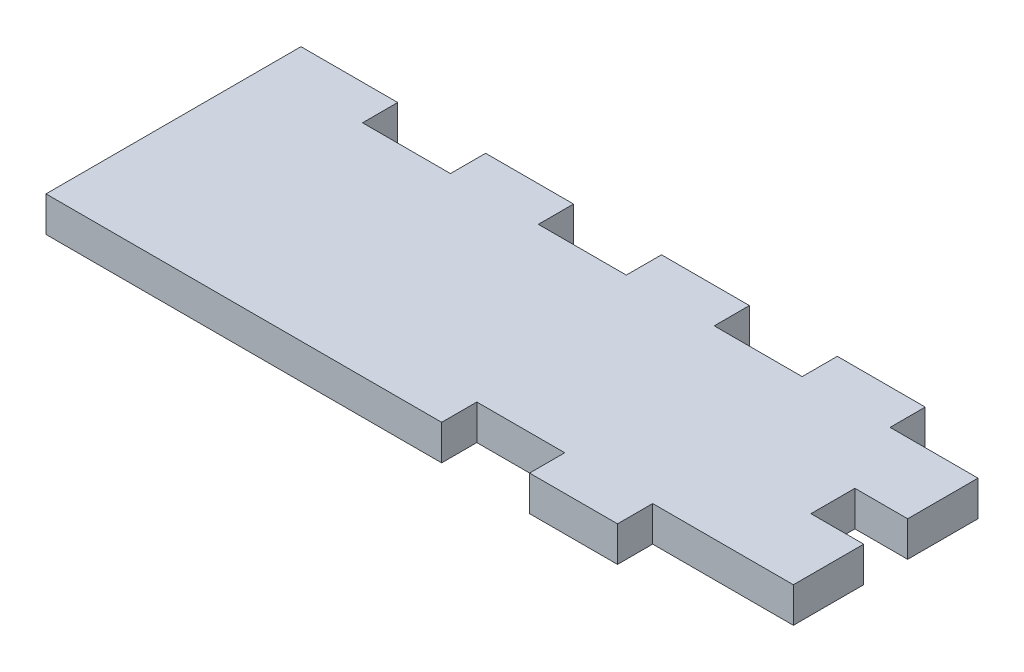
ISO-10303-21;
HEADER;
FILE_DESCRIPTION(('STEP AP214'),'2;1');
FILE_NAME('part.step','',(''),(''),'','','');
FILE_SCHEMA(('AUTOMOTIVE_DESIGN { 1 0 10303 214 1 1 1 1 }'));
ENDSEC;
DATA;
#1=APPLICATION_CONTEXT('core data for automotive mechanical design processes');
#2=APPLICATION_PROTOCOL_DEFINITION('international standard','automotive_design',2000,#1);
#3=PRODUCT_CONTEXT('',#1,'mechanical');
#4=PRODUCT('Part','Part','',(#3));
#5=PRODUCT_RELATED_PRODUCT_CATEGORY('part','',(#4));
#6=PRODUCT_DEFINITION_FORMATION('','',#4);
#7=PRODUCT_DEFINITION_CONTEXT('part definition',#1,'design');
#8=PRODUCT_DEFINITION('design','',#6,#7);
#9=PRODUCT_DEFINITION_SHAPE('','',#8);
#10=(LENGTH_UNIT() NAMED_UNIT(*) SI_UNIT(.MILLI.,.METRE.));
#11=(NAMED_UNIT(*) PLANE_ANGLE_UNIT() SI_UNIT($,.RADIAN.));
#12=(NAMED_UNIT(*) SI_UNIT($,.STERADIAN.) SOLID_ANGLE_UNIT());
#13=UNCERTAINTY_MEASURE_WITH_UNIT(LENGTH_MEASURE(1.E-05),#10,'distance_accuracy_value','');
#14=(GEOMETRIC_REPRESENTATION_CONTEXT(3) GLOBAL_UNCERTAINTY_ASSIGNED_CONTEXT((#13)) GLOBAL_UNIT_ASSIGNED_CONTEXT((#10,
#11,#12)) REPRESENTATION_CONTEXT('',''));
#15=CARTESIAN_POINT('',(0.,0.,0.));
#16=DIRECTION('',(0.,0.,1.));
#17=DIRECTION('',(1.,0.,0.));
#18=AXIS2_PLACEMENT_3D('',#15,#16,#17);
#19=CARTESIAN_POINT('',(0.,4.,21.));
#20=DIRECTION('',(0.,0.,-1.));
#21=DIRECTION('',(-1.,0.,0.));
#22=AXIS2_PLACEMENT_3D('',#19,#20,#21);
#23=PLANE('',#22);
#24=DIRECTION('',(1.,0.,0.));
#25=VECTOR('',#24,1.);
#26=CARTESIAN_POINT('',(0.,0.,21.));
#27=LINE('',#26,#25);
#28=CARTESIAN_POINT('',(45.,0.,21.));
#29=VERTEX_POINT('',#28);
#30=CARTESIAN_POINT('',(55.,0.,21.));
#31=VERTEX_POINT('',#30);
#32=EDGE_CURVE('E426',#29,#31,#27,.T.);
#33=ORIENTED_EDGE('',*,*,#32,.T.);
#34=DIRECTION('',(0.,1.,0.));
#35=VECTOR('',#34,1.);
#36=CARTESIAN_POINT('',(55.,0.,21.));
#37=LINE('',#36,#35);
#38=CARTESIAN_POINT('',(55.,4.,21.));
#39=VERTEX_POINT('',#38);
#40=EDGE_CURVE('E61',#31,#39,#37,.T.);
#41=ORIENTED_EDGE('',*,*,#40,.T.);
#42=DIRECTION('',(1.,0.,0.));
#43=VECTOR('',#42,1.);
#44=CARTESIAN_POINT('',(0.,4.,21.));
#45=LINE('',#44,#43);
#46=CARTESIAN_POINT('',(45.,4.,21.));
#47=VERTEX_POINT('',#46);
#48=EDGE_CURVE('E419',#47,#39,#45,.T.);
#49=ORIENTED_EDGE('',*,*,#48,.F.);
#50=DIRECTION('',(0.,1.,0.));
#51=VECTOR('',#50,1.);
#52=CARTESIAN_POINT('',(45.,0.,21.));
#53=LINE('',#52,#51);
#54=EDGE_CURVE('E272',#29,#47,#53,.T.);
#55=ORIENTED_EDGE('',*,*,#54,.F.);
#56=EDGE_LOOP('',(#33,#41,#49,#55));
#57=FACE_BOUND('',#56,.T.);
#58=ADVANCED_FACE('F35',(#57),#23,.F.);
#59=CARTESIAN_POINT('',(65.,4.,21.));
#60=VERTEX_POINT('',#59);
#61=CARTESIAN_POINT('',(81.,4.,21.));
#62=VERTEX_POINT('',#61);
#63=EDGE_CURVE('E53',#60,#62,#45,.T.);
#64=ORIENTED_EDGE('',*,*,#63,.F.);
#65=DIRECTION('',(0.,1.,0.));
#66=VECTOR('',#65,1.);
#67=CARTESIAN_POINT('',(65.,0.,21.));
#68=LINE('',#67,#66);
#69=CARTESIAN_POINT('',(65.,0.,21.));
#70=VERTEX_POINT('',#69);
#71=EDGE_CURVE('E257',#70,#60,#68,.T.);
#72=ORIENTED_EDGE('',*,*,#71,.F.);
#73=CARTESIAN_POINT('',(81.,0.,21.));
#74=VERTEX_POINT('',#73);
#75=EDGE_CURVE('E425',#70,#74,#27,.T.);
#76=ORIENTED_EDGE('',*,*,#75,.T.);
#77=DIRECTION('',(0.,-1.,0.));
#78=VECTOR('',#77,1.);
#79=CARTESIAN_POINT('',(81.,4.,21.));
#80=LINE('',#79,#78);
#81=EDGE_CURVE('E398',#62,#74,#80,.T.);
#82=ORIENTED_EDGE('',*,*,#81,.F.);
#83=EDGE_LOOP('',(#64,#72,#76,#82));
#84=FACE_BOUND('',#83,.T.);
#85=ADVANCED_FACE('F512',(#84),#23,.F.);
#86=CARTESIAN_POINT('',(0.,4.,0.));
#87=DIRECTION('',(0.,0.,1.));
#88=DIRECTION('',(1.,0.,0.));
#89=AXIS2_PLACEMENT_3D('',#86,#87,#88);
#90=PLANE('',#89);
#91=DIRECTION('',(-1.,0.,0.));
#92=VECTOR('',#91,1.);
#93=CARTESIAN_POINT('',(0.,0.,0.));
#94=LINE('',#93,#92);
#95=CARTESIAN_POINT('',(21.,0.,0.));
#96=VERTEX_POINT('',#95);
#97=CARTESIAN_POINT('',(11.,0.,0.));
#98=VERTEX_POINT('',#97);
#99=EDGE_CURVE('E428',#96,#98,#94,.T.);
#100=ORIENTED_EDGE('',*,*,#99,.T.);
#101=DIRECTION('',(0.,1.,0.));
#102=VECTOR('',#101,1.);
#103=CARTESIAN_POINT('',(11.,0.,0.));
#104=LINE('',#103,#102);
#105=CARTESIAN_POINT('',(11.,4.,0.));
#106=VERTEX_POINT('',#105);
#107=EDGE_CURVE('E295',#98,#106,#104,.T.);
#108=ORIENTED_EDGE('',*,*,#107,.T.);
#109=DIRECTION('',(-1.,0.,0.));
#110=VECTOR('',#109,1.);
#111=CARTESIAN_POINT('',(0.,4.,0.));
#112=LINE('',#111,#110);
#113=CARTESIAN_POINT('',(21.,4.,0.));
#114=VERTEX_POINT('',#113);
#115=EDGE_CURVE('E46',#114,#106,#112,.T.);
#116=ORIENTED_EDGE('',*,*,#115,.F.);
#117=DIRECTION('',(0.,1.,0.));
#118=VECTOR('',#117,1.);
#119=CARTESIAN_POINT('',(21.,0.,0.));
#120=LINE('',#119,#118);
#121=EDGE_CURVE('E320',#96,#114,#120,.T.);
#122=ORIENTED_EDGE('',*,*,#121,.F.);
#123=EDGE_LOOP('',(#100,#108,#116,#122));
#124=FACE_BOUND('',#123,.T.);
#125=ADVANCED_FACE('F486',(#124),#90,.F.);
#126=CARTESIAN_POINT('',(41.,0.,0.));
#127=VERTEX_POINT('',#126);
#128=CARTESIAN_POINT('',(31.,0.,0.));
#129=VERTEX_POINT('',#128);
#130=EDGE_CURVE('E431',#127,#129,#94,.T.);
#131=ORIENTED_EDGE('',*,*,#130,.T.);
#132=DIRECTION('',(0.,1.,0.));
#133=VECTOR('',#132,1.);
#134=CARTESIAN_POINT('',(31.,0.,0.));
#135=LINE('',#134,#133);
#136=CARTESIAN_POINT('',(31.,4.,0.));
#137=VERTEX_POINT('',#136);
#138=EDGE_CURVE('E317',#129,#137,#135,.T.);
#139=ORIENTED_EDGE('',*,*,#138,.T.);
#140=CARTESIAN_POINT('',(41.,4.,0.));
#141=VERTEX_POINT('',#140);
#142=EDGE_CURVE('E460',#141,#137,#112,.T.);
#143=ORIENTED_EDGE('',*,*,#142,.F.);
#144=DIRECTION('',(0.,1.,0.));
#145=VECTOR('',#144,1.);
#146=CARTESIAN_POINT('',(41.,0.,0.));
#147=LINE('',#146,#145);
#148=EDGE_CURVE('E347',#127,#141,#147,.T.);
#149=ORIENTED_EDGE('',*,*,#148,.F.);
#150=EDGE_LOOP('',(#131,#139,#143,#149));
#151=FACE_BOUND('',#150,.T.);
#152=ADVANCED_FACE('F497',(#151),#90,.F.);
#153=CARTESIAN_POINT('',(61.,0.,0.));
#154=VERTEX_POINT('',#153);
#155=CARTESIAN_POINT('',(51.,0.,0.));
#156=VERTEX_POINT('',#155);
#157=EDGE_CURVE('E435',#154,#156,#94,.T.);
#158=ORIENTED_EDGE('',*,*,#157,.T.);
#159=DIRECTION('',(0.,1.,0.));
#160=VECTOR('',#159,1.);
#161=CARTESIAN_POINT('',(51.,0.,0.));
#162=LINE('',#161,#160);
#163=CARTESIAN_POINT('',(51.,4.,0.));
#164=VERTEX_POINT('',#163);
#165=EDGE_CURVE('E344',#156,#164,#162,.T.);
#166=ORIENTED_EDGE('',*,*,#165,.T.);
#167=CARTESIAN_POINT('',(61.,4.,0.));
#168=VERTEX_POINT('',#167);
#169=EDGE_CURVE('E44',#168,#164,#112,.T.);
#170=ORIENTED_EDGE('',*,*,#169,.F.);
#171=DIRECTION('',(0.,1.,0.));
#172=VECTOR('',#171,1.);
#173=CARTESIAN_POINT('',(61.,0.,0.));
#174=LINE('',#173,#172);
#175=EDGE_CURVE('E374',#154,#168,#174,.T.);
#176=ORIENTED_EDGE('',*,*,#175,.F.);
#177=EDGE_LOOP('',(#158,#166,#170,#176));
#178=FACE_BOUND('',#177,.T.);
#179=ADVANCED_FACE('F443',(#178),#90,.F.);
#180=CARTESIAN_POINT('',(75.,4.,0.));
#181=DIRECTION('',(-1.,0.,0.));
#182=DIRECTION('',(0.,0.,1.));
#183=AXIS2_PLACEMENT_3D('',#180,#181,#182);
#184=PLANE('',#183);
#185=DIRECTION('',(0.,-1.,0.));
#186=VECTOR('',#185,1.);
#187=CARTESIAN_POINT('',(75.,4.,8.));
#188=LINE('',#187,#186);
#189=CARTESIAN_POINT('',(75.,4.,8.));
#190=VERTEX_POINT('',#189);
#191=CARTESIAN_POINT('',(75.,0.,8.));
#192=VERTEX_POINT('',#191);
#193=EDGE_CURVE('E373',#190,#192,#188,.T.);
#194=ORIENTED_EDGE('',*,*,#193,.F.);
#195=DIRECTION('',(0.,0.,-1.));
#196=VECTOR('',#195,1.);
#197=CARTESIAN_POINT('',(75.,4.,0.));
#198=LINE('',#197,#196);
#199=CARTESIAN_POINT('',(75.,4.,13.));
#200=VERTEX_POINT('',#199);
#201=EDGE_CURVE('E421',#200,#190,#198,.T.);
#202=ORIENTED_EDGE('',*,*,#201,.F.);
#203=DIRECTION('',(0.,1.,0.));
#204=VECTOR('',#203,1.);
#205=CARTESIAN_POINT('',(75.,4.,13.));
#206=LINE('',#205,#204);
#207=CARTESIAN_POINT('',(75.,0.,13.));
#208=VERTEX_POINT('',#207);
#209=EDGE_CURVE('E397',#208,#200,#206,.T.);
#210=ORIENTED_EDGE('',*,*,#209,.F.);
#211=DIRECTION('',(0.,0.,-1.));
#212=VECTOR('',#211,1.);
#213=CARTESIAN_POINT('',(75.,0.,0.));
#214=LINE('',#213,#212);
#215=EDGE_CURVE('E427',#208,#192,#214,.T.);
#216=ORIENTED_EDGE('',*,*,#215,.T.);
#217=EDGE_LOOP('',(#194,#202,#210,#216));
#218=FACE_BOUND('',#217,.T.);
#219=ADVANCED_FACE('F518',(#218),#184,.F.);
#220=CARTESIAN_POINT('',(0.,4.,0.));
#221=DIRECTION('',(1.,0.,0.));
#222=DIRECTION('',(0.,0.,-1.));
#223=AXIS2_PLACEMENT_3D('',#220,#221,#222);
#224=PLANE('',#223);
#225=DIRECTION('',(0.,0.,1.));
#226=VECTOR('',#225,1.);
#227=CARTESIAN_POINT('',(0.,0.,0.));
#228=LINE('',#227,#226);
#229=CARTESIAN_POINT('',(0.,0.,-4.));
#230=VERTEX_POINT('',#229);
#231=CARTESIAN_POINT('',(0.,0.,25.));
#232=VERTEX_POINT('',#231);
#233=EDGE_CURVE('E416',#230,#232,#228,.T.);
#234=ORIENTED_EDGE('',*,*,#233,.T.);
#235=DIRECTION('',(0.,1.,0.));
#236=VECTOR('',#235,1.);
#237=CARTESIAN_POINT('',(0.,0.,25.));
#238=LINE('',#237,#236);
#239=CARTESIAN_POINT('',(0.,4.,25.));
#240=VERTEX_POINT('',#239);
#241=EDGE_CURVE('E267',#232,#240,#238,.T.);
#242=ORIENTED_EDGE('',*,*,#241,.T.);
#243=DIRECTION('',(0.,0.,1.));
#244=VECTOR('',#243,1.);
#245=CARTESIAN_POINT('',(0.,4.,0.));
#246=LINE('',#245,#244);
#247=CARTESIAN_POINT('',(0.,4.,-4.));
#248=VERTEX_POINT('',#247);
#249=EDGE_CURVE('E417',#248,#240,#246,.T.);
#250=ORIENTED_EDGE('',*,*,#249,.F.);
#251=DIRECTION('',(0.,1.,0.));
#252=VECTOR('',#251,1.);
#253=CARTESIAN_POINT('',(0.,0.,-4.));
#254=LINE('',#253,#252);
#255=EDGE_CURVE('E275',#230,#248,#254,.T.);
#256=ORIENTED_EDGE('',*,*,#255,.F.);
#257=EDGE_LOOP('',(#234,#242,#250,#256));
#258=FACE_BOUND('',#257,.T.);
#259=ADVANCED_FACE('F37',(#258),#224,.F.);
#260=CARTESIAN_POINT('',(81.,0.,0.));
#261=VERTEX_POINT('',#260);
#262=CARTESIAN_POINT('',(71.,0.,0.));
#263=VERTEX_POINT('',#262);
#264=EDGE_CURVE('E39',#261,#263,#94,.T.);
#265=ORIENTED_EDGE('',*,*,#264,.T.);
#266=DIRECTION('',(0.,1.,0.));
#267=VECTOR('',#266,1.);
#268=CARTESIAN_POINT('',(71.,0.,0.));
#269=LINE('',#268,#267);
#270=CARTESIAN_POINT('',(71.,4.,0.));
#271=VERTEX_POINT('',#270);
#272=EDGE_CURVE('E370',#263,#271,#269,.T.);
#273=ORIENTED_EDGE('',*,*,#272,.T.);
#274=CARTESIAN_POINT('',(81.,4.,0.));
#275=VERTEX_POINT('',#274);
#276=EDGE_CURVE('E11',#275,#271,#112,.T.);
#277=ORIENTED_EDGE('',*,*,#276,.F.);
#278=DIRECTION('',(0.,1.,0.));
#279=VECTOR('',#278,1.);
#280=CARTESIAN_POINT('',(81.,4.,0.));
#281=LINE('',#280,#279);
#282=EDGE_CURVE('E379',#261,#275,#281,.T.);
#283=ORIENTED_EDGE('',*,*,#282,.F.);
#284=EDGE_LOOP('',(#265,#273,#277,#283));
#285=FACE_BOUND('',#284,.T.);
#286=ADVANCED_FACE('F521',(#285),#90,.F.);
#287=CARTESIAN_POINT('',(0.,4.,0.));
#288=DIRECTION('',(0.,1.,0.));
#289=DIRECTION('',(0.,0.,1.));
#290=AXIS2_PLACEMENT_3D('',#287,#288,#289);
#291=PLANE('',#290);
#292=DIRECTION('',(-1.,0.,0.));
#293=VECTOR('',#292,1.);
#294=CARTESIAN_POINT('',(11.,4.,-4.));
#295=LINE('',#294,#293);
#296=CARTESIAN_POINT('',(11.,4.,-4.));
#297=VERTEX_POINT('',#296);
#298=EDGE_CURVE('E287',#297,#248,#295,.T.);
#299=ORIENTED_EDGE('',*,*,#298,.T.);
#300=ORIENTED_EDGE('',*,*,#249,.T.);
#301=DIRECTION('',(1.,0.,0.));
#302=VECTOR('',#301,1.);
#303=CARTESIAN_POINT('',(0.,4.,25.));
#304=LINE('',#303,#302);
#305=CARTESIAN_POINT('',(45.,4.,25.));
#306=VERTEX_POINT('',#305);
#307=EDGE_CURVE('E256',#240,#306,#304,.T.);
#308=ORIENTED_EDGE('',*,*,#307,.T.);
#309=DIRECTION('',(0.,0.,-1.));
#310=VECTOR('',#309,1.);
#311=CARTESIAN_POINT('',(45.,4.,21.));
#312=LINE('',#311,#310);
#313=EDGE_CURVE('E264',#306,#47,#312,.T.);
#314=ORIENTED_EDGE('',*,*,#313,.T.);
#315=ORIENTED_EDGE('',*,*,#48,.T.);
#316=DIRECTION('',(0.,0.,1.));
#317=VECTOR('',#316,1.);
#318=CARTESIAN_POINT('',(55.,4.,25.));
#319=LINE('',#318,#317);
#320=CARTESIAN_POINT('',(55.,4.,25.));
#321=VERTEX_POINT('',#320);
#322=EDGE_CURVE('E252',#39,#321,#319,.T.);
#323=ORIENTED_EDGE('',*,*,#322,.T.);
#324=DIRECTION('',(1.,0.,0.));
#325=VECTOR('',#324,1.);
#326=CARTESIAN_POINT('',(55.,4.,25.));
#327=LINE('',#326,#325);
#328=CARTESIAN_POINT('',(65.,4.,25.));
#329=VERTEX_POINT('',#328);
#330=EDGE_CURVE('E229',#321,#329,#327,.T.);
#331=ORIENTED_EDGE('',*,*,#330,.T.);
#332=DIRECTION('',(0.,0.,-1.));
#333=VECTOR('',#332,1.);
#334=CARTESIAN_POINT('',(65.,4.,25.));
#335=LINE('',#334,#333);
#336=EDGE_CURVE('E246',#329,#60,#335,.T.);
#337=ORIENTED_EDGE('',*,*,#336,.T.);
#338=ORIENTED_EDGE('',*,*,#63,.T.);
#339=DIRECTION('',(0.,0.,1.));
#340=VECTOR('',#339,1.);
#341=CARTESIAN_POINT('',(81.,4.,21.));
#342=LINE('',#341,#340);
#343=CARTESIAN_POINT('',(81.,4.,13.));
#344=VERTEX_POINT('',#343);
#345=EDGE_CURVE('E405',#344,#62,#342,.T.);
#346=ORIENTED_EDGE('',*,*,#345,.F.);
#347=DIRECTION('',(-1.,0.,0.));
#348=VECTOR('',#347,1.);
#349=CARTESIAN_POINT('',(81.,4.,13.));
#350=LINE('',#349,#348);
#351=EDGE_CURVE('E408',#344,#200,#350,.T.);
#352=ORIENTED_EDGE('',*,*,#351,.T.);
#353=ORIENTED_EDGE('',*,*,#201,.T.);
#354=DIRECTION('',(-1.,0.,0.));
#355=VECTOR('',#354,1.);
#356=CARTESIAN_POINT('',(81.,4.,8.));
#357=LINE('',#356,#355);
#358=CARTESIAN_POINT('',(81.,4.,8.));
#359=VERTEX_POINT('',#358);
#360=EDGE_CURVE('E394',#359,#190,#357,.T.);
#361=ORIENTED_EDGE('',*,*,#360,.F.);
#362=DIRECTION('',(0.,0.,1.));
#363=VECTOR('',#362,1.);
#364=CARTESIAN_POINT('',(81.,4.,0.));
#365=LINE('',#364,#363);
#366=EDGE_CURVE('E382',#275,#359,#365,.T.);
#367=ORIENTED_EDGE('',*,*,#366,.F.);
#368=ORIENTED_EDGE('',*,*,#276,.T.);
#369=DIRECTION('',(0.,0.,-1.));
#370=VECTOR('',#369,1.);
#371=CARTESIAN_POINT('',(71.,4.,0.));
#372=LINE('',#371,#370);
#373=CARTESIAN_POINT('',(71.,4.,-4.));
#374=VERTEX_POINT('',#373);
#375=EDGE_CURVE('E346',#271,#374,#372,.T.);
#376=ORIENTED_EDGE('',*,*,#375,.T.);
#377=DIRECTION('',(-1.,0.,0.));
#378=VECTOR('',#377,1.);
#379=CARTESIAN_POINT('',(71.,4.,-4.));
#380=LINE('',#379,#378);
#381=CARTESIAN_POINT('',(61.,4.,-4.));
#382=VERTEX_POINT('',#381);
#383=EDGE_CURVE('E365',#374,#382,#380,.T.);
#384=ORIENTED_EDGE('',*,*,#383,.T.);
#385=DIRECTION('',(0.,0.,1.));
#386=VECTOR('',#385,1.);
#387=CARTESIAN_POINT('',(61.,4.,0.));
#388=LINE('',#387,#386);
#389=EDGE_CURVE('E357',#382,#168,#388,.T.);
#390=ORIENTED_EDGE('',*,*,#389,.T.);
#391=ORIENTED_EDGE('',*,*,#169,.T.);
#392=DIRECTION('',(0.,0.,-1.));
#393=VECTOR('',#392,1.);
#394=CARTESIAN_POINT('',(51.,4.,0.));
#395=LINE('',#394,#393);
#396=CARTESIAN_POINT('',(51.,4.,-4.));
#397=VERTEX_POINT('',#396);
#398=EDGE_CURVE('E319',#164,#397,#395,.T.);
#399=ORIENTED_EDGE('',*,*,#398,.T.);
#400=DIRECTION('',(-1.,0.,0.));
#401=VECTOR('',#400,1.);
#402=CARTESIAN_POINT('',(51.,4.,-4.));
#403=LINE('',#402,#401);
#404=CARTESIAN_POINT('',(41.,4.,-4.));
#405=VERTEX_POINT('',#404);
#406=EDGE_CURVE('E339',#397,#405,#403,.T.);
#407=ORIENTED_EDGE('',*,*,#406,.T.);
#408=DIRECTION('',(0.,0.,1.));
#409=VECTOR('',#408,1.);
#410=CARTESIAN_POINT('',(41.,4.,0.));
#411=LINE('',#410,#409);
#412=EDGE_CURVE('E330',#405,#141,#411,.T.);
#413=ORIENTED_EDGE('',*,*,#412,.T.);
#414=ORIENTED_EDGE('',*,*,#142,.T.);
#415=DIRECTION('',(0.,0.,-1.));
#416=VECTOR('',#415,1.);
#417=CARTESIAN_POINT('',(31.,4.,0.));
#418=LINE('',#417,#416);
#419=CARTESIAN_POINT('',(31.,4.,-4.));
#420=VERTEX_POINT('',#419);
#421=EDGE_CURVE('E297',#137,#420,#418,.T.);
#422=ORIENTED_EDGE('',*,*,#421,.T.);
#423=DIRECTION('',(-1.,0.,0.));
#424=VECTOR('',#423,1.);
#425=CARTESIAN_POINT('',(31.,4.,-4.));
#426=LINE('',#425,#424);
#427=CARTESIAN_POINT('',(21.,4.,-4.));
#428=VERTEX_POINT('',#427);
#429=EDGE_CURVE('E312',#420,#428,#426,.T.);
#430=ORIENTED_EDGE('',*,*,#429,.T.);
#431=DIRECTION('',(0.,0.,1.));
#432=VECTOR('',#431,1.);
#433=CARTESIAN_POINT('',(21.,4.,0.));
#434=LINE('',#433,#432);
#435=EDGE_CURVE('E303',#428,#114,#434,.T.);
#436=ORIENTED_EDGE('',*,*,#435,.T.);
#437=ORIENTED_EDGE('',*,*,#115,.T.);
#438=DIRECTION('',(0.,0.,-1.));
#439=VECTOR('',#438,1.);
#440=CARTESIAN_POINT('',(11.,4.,0.));
#441=LINE('',#440,#439);
#442=EDGE_CURVE('E282',#106,#297,#441,.T.);
#443=ORIENTED_EDGE('',*,*,#442,.T.);
#444=EDGE_LOOP('',(#299,#300,#308,#314,#315,#323,#331,#337,#338,#346,#352,#353,#361,#367,#368,
#376,#384,#390,#391,#399,#407,#413,#414,#422,#430,#436,#437,#443));
#445=FACE_BOUND('',#444,.T.);
#446=ADVANCED_FACE('F458',(#445),#291,.T.);
#447=CARTESIAN_POINT('',(0.,0.,0.));
#448=DIRECTION('',(0.,1.,0.));
#449=DIRECTION('',(0.,0.,1.));
#450=AXIS2_PLACEMENT_3D('',#447,#448,#449);
#451=PLANE('',#450);
#452=ORIENTED_EDGE('',*,*,#233,.F.);
#453=DIRECTION('',(-1.,0.,0.));
#454=VECTOR('',#453,1.);
#455=CARTESIAN_POINT('',(11.,0.,-4.));
#456=LINE('',#455,#454);
#457=CARTESIAN_POINT('',(11.,0.,-4.));
#458=VERTEX_POINT('',#457);
#459=EDGE_CURVE('E286',#458,#230,#456,.T.);
#460=ORIENTED_EDGE('',*,*,#459,.F.);
#461=DIRECTION('',(0.,0.,-1.));
#462=VECTOR('',#461,1.);
#463=CARTESIAN_POINT('',(11.,0.,0.));
#464=LINE('',#463,#462);
#465=EDGE_CURVE('E283',#98,#458,#464,.T.);
#466=ORIENTED_EDGE('',*,*,#465,.F.);
#467=ORIENTED_EDGE('',*,*,#99,.F.);
#468=DIRECTION('',(0.,0.,1.));
#469=VECTOR('',#468,1.);
#470=CARTESIAN_POINT('',(21.,0.,0.));
#471=LINE('',#470,#469);
#472=CARTESIAN_POINT('',(21.,0.,-4.));
#473=VERTEX_POINT('',#472);
#474=EDGE_CURVE('E306',#473,#96,#471,.T.);
#475=ORIENTED_EDGE('',*,*,#474,.F.);
#476=DIRECTION('',(-1.,0.,0.));
#477=VECTOR('',#476,1.);
#478=CARTESIAN_POINT('',(31.,0.,-4.));
#479=LINE('',#478,#477);
#480=CARTESIAN_POINT('',(31.,0.,-4.));
#481=VERTEX_POINT('',#480);
#482=EDGE_CURVE('E302',#481,#473,#479,.T.);
#483=ORIENTED_EDGE('',*,*,#482,.F.);
#484=DIRECTION('',(0.,0.,-1.));
#485=VECTOR('',#484,1.);
#486=CARTESIAN_POINT('',(31.,0.,0.));
#487=LINE('',#486,#485);
#488=EDGE_CURVE('E299',#129,#481,#487,.T.);
#489=ORIENTED_EDGE('',*,*,#488,.F.);
#490=ORIENTED_EDGE('',*,*,#130,.F.);
#491=DIRECTION('',(0.,0.,1.));
#492=VECTOR('',#491,1.);
#493=CARTESIAN_POINT('',(41.,0.,0.));
#494=LINE('',#493,#492);
#495=CARTESIAN_POINT('',(41.,0.,-4.));
#496=VERTEX_POINT('',#495);
#497=EDGE_CURVE('E333',#496,#127,#494,.T.);
#498=ORIENTED_EDGE('',*,*,#497,.F.);
#499=DIRECTION('',(-1.,0.,0.));
#500=VECTOR('',#499,1.);
#501=CARTESIAN_POINT('',(51.,0.,-4.));
#502=LINE('',#501,#500);
#503=CARTESIAN_POINT('',(51.,0.,-4.));
#504=VERTEX_POINT('',#503);
#505=EDGE_CURVE('E329',#504,#496,#502,.T.);
#506=ORIENTED_EDGE('',*,*,#505,.F.);
#507=DIRECTION('',(0.,0.,-1.));
#508=VECTOR('',#507,1.);
#509=CARTESIAN_POINT('',(51.,0.,0.));
#510=LINE('',#509,#508);
#511=EDGE_CURVE('E326',#156,#504,#510,.T.);
#512=ORIENTED_EDGE('',*,*,#511,.F.);
#513=ORIENTED_EDGE('',*,*,#157,.F.);
#514=DIRECTION('',(0.,0.,1.));
#515=VECTOR('',#514,1.);
#516=CARTESIAN_POINT('',(61.,0.,0.));
#517=LINE('',#516,#515);
#518=CARTESIAN_POINT('',(61.,0.,-4.));
#519=VERTEX_POINT('',#518);
#520=EDGE_CURVE('E360',#519,#154,#517,.T.);
#521=ORIENTED_EDGE('',*,*,#520,.F.);
#522=DIRECTION('',(-1.,0.,0.));
#523=VECTOR('',#522,1.);
#524=CARTESIAN_POINT('',(71.,0.,-4.));
#525=LINE('',#524,#523);
#526=CARTESIAN_POINT('',(71.,0.,-4.));
#527=VERTEX_POINT('',#526);
#528=EDGE_CURVE('E356',#527,#519,#525,.T.);
#529=ORIENTED_EDGE('',*,*,#528,.F.);
#530=DIRECTION('',(0.,0.,-1.));
#531=VECTOR('',#530,1.);
#532=CARTESIAN_POINT('',(71.,0.,0.));
#533=LINE('',#532,#531);
#534=EDGE_CURVE('E353',#263,#527,#533,.T.);
#535=ORIENTED_EDGE('',*,*,#534,.F.);
#536=ORIENTED_EDGE('',*,*,#264,.F.);
#537=DIRECTION('',(0.,0.,-1.));
#538=VECTOR('',#537,1.);
#539=CARTESIAN_POINT('',(81.,0.,0.));
#540=LINE('',#539,#538);
#541=CARTESIAN_POINT('',(81.,0.,8.));
#542=VERTEX_POINT('',#541);
#543=EDGE_CURVE('E386',#542,#261,#540,.T.);
#544=ORIENTED_EDGE('',*,*,#543,.F.);
#545=DIRECTION('',(-1.,0.,0.));
#546=VECTOR('',#545,1.);
#547=CARTESIAN_POINT('',(81.,0.,8.));
#548=LINE('',#547,#546);
#549=EDGE_CURVE('E389',#542,#192,#548,.T.);
#550=ORIENTED_EDGE('',*,*,#549,.T.);
#551=ORIENTED_EDGE('',*,*,#215,.F.);
#552=DIRECTION('',(-1.,0.,0.));
#553=VECTOR('',#552,1.);
#554=CARTESIAN_POINT('',(81.,0.,13.));
#555=LINE('',#554,#553);
#556=CARTESIAN_POINT('',(81.,0.,13.));
#557=VERTEX_POINT('',#556);
#558=EDGE_CURVE('E413',#557,#208,#555,.T.);
#559=ORIENTED_EDGE('',*,*,#558,.F.);
#560=DIRECTION('',(0.,0.,-1.));
#561=VECTOR('',#560,1.);
#562=CARTESIAN_POINT('',(81.,0.,21.));
#563=LINE('',#562,#561);
#564=EDGE_CURVE('E401',#74,#557,#563,.T.);
#565=ORIENTED_EDGE('',*,*,#564,.F.);
#566=ORIENTED_EDGE('',*,*,#75,.F.);
#567=DIRECTION('',(0.,0.,-1.));
#568=VECTOR('',#567,1.);
#569=CARTESIAN_POINT('',(65.,0.,25.));
#570=LINE('',#569,#568);
#571=CARTESIAN_POINT('',(65.,0.,25.));
#572=VERTEX_POINT('',#571);
#573=EDGE_CURVE('E235',#572,#70,#570,.T.);
#574=ORIENTED_EDGE('',*,*,#573,.F.);
#575=DIRECTION('',(1.,0.,0.));
#576=VECTOR('',#575,1.);
#577=CARTESIAN_POINT('',(55.,0.,25.));
#578=LINE('',#577,#576);
#579=CARTESIAN_POINT('',(55.,0.,25.));
#580=VERTEX_POINT('',#579);
#581=EDGE_CURVE('E227',#580,#572,#578,.T.);
#582=ORIENTED_EDGE('',*,*,#581,.F.);
#583=DIRECTION('',(0.,0.,1.));
#584=VECTOR('',#583,1.);
#585=CARTESIAN_POINT('',(55.,0.,25.));
#586=LINE('',#585,#584);
#587=EDGE_CURVE('E242',#31,#580,#586,.T.);
#588=ORIENTED_EDGE('',*,*,#587,.F.);
#589=ORIENTED_EDGE('',*,*,#32,.F.);
#590=DIRECTION('',(0.,0.,-1.));
#591=VECTOR('',#590,1.);
#592=CARTESIAN_POINT('',(45.,0.,21.));
#593=LINE('',#592,#591);
#594=CARTESIAN_POINT('',(45.,0.,25.));
#595=VERTEX_POINT('',#594);
#596=EDGE_CURVE('E263',#595,#29,#593,.T.);
#597=ORIENTED_EDGE('',*,*,#596,.F.);
#598=DIRECTION('',(1.,0.,0.));
#599=VECTOR('',#598,1.);
#600=CARTESIAN_POINT('',(0.,0.,25.));
#601=LINE('',#600,#599);
#602=EDGE_CURVE('E260',#232,#595,#601,.T.);
#603=ORIENTED_EDGE('',*,*,#602,.F.);
#604=EDGE_LOOP('',(#452,#460,#466,#467,#475,#483,#489,#490,#498,#506,#512,#513,#521,#529,#535,
#536,#544,#550,#551,#559,#565,#566,#574,#582,#588,#589,#597,#603));
#605=FACE_BOUND('',#604,.T.);
#606=ADVANCED_FACE('F240',(#605),#451,.F.);
#607=CARTESIAN_POINT('',(81.,4.,13.));
#608=DIRECTION('',(0.,0.,1.));
#609=DIRECTION('',(1.,0.,0.));
#610=AXIS2_PLACEMENT_3D('',#607,#608,#609);
#611=PLANE('',#610);
#612=ORIENTED_EDGE('',*,*,#209,.T.);
#613=ORIENTED_EDGE('',*,*,#351,.F.);
#614=DIRECTION('',(0.,1.,0.));
#615=VECTOR('',#614,1.);
#616=CARTESIAN_POINT('',(81.,4.,13.));
#617=LINE('',#616,#615);
#618=EDGE_CURVE('E403',#557,#344,#617,.T.);
#619=ORIENTED_EDGE('',*,*,#618,.F.);
#620=ORIENTED_EDGE('',*,*,#558,.T.);
#621=EDGE_LOOP('',(#612,#613,#619,#620));
#622=FACE_BOUND('',#621,.T.);
#623=ADVANCED_FACE('F526',(#622),#611,.F.);
#624=CARTESIAN_POINT('',(81.,0.,0.));
#625=DIRECTION('',(1.,0.,0.));
#626=DIRECTION('',(0.,0.,-1.));
#627=AXIS2_PLACEMENT_3D('',#624,#625,#626);
#628=PLANE('',#627);
#629=ORIENTED_EDGE('',*,*,#81,.T.);
#630=ORIENTED_EDGE('',*,*,#564,.T.);
#631=ORIENTED_EDGE('',*,*,#618,.T.);
#632=ORIENTED_EDGE('',*,*,#345,.T.);
#633=EDGE_LOOP('',(#629,#630,#631,#632));
#634=FACE_BOUND('',#633,.T.);
#635=ADVANCED_FACE('F531',(#634),#628,.T.);
#636=CARTESIAN_POINT('',(81.,4.,8.));
#637=DIRECTION('',(0.,0.,-1.));
#638=DIRECTION('',(-1.,0.,0.));
#639=AXIS2_PLACEMENT_3D('',#636,#637,#638);
#640=PLANE('',#639);
#641=ORIENTED_EDGE('',*,*,#193,.T.);
#642=ORIENTED_EDGE('',*,*,#549,.F.);
#643=DIRECTION('',(0.,-1.,0.));
#644=VECTOR('',#643,1.);
#645=CARTESIAN_POINT('',(81.,4.,8.));
#646=LINE('',#645,#644);
#647=EDGE_CURVE('E384',#359,#542,#646,.T.);
#648=ORIENTED_EDGE('',*,*,#647,.F.);
#649=ORIENTED_EDGE('',*,*,#360,.T.);
#650=EDGE_LOOP('',(#641,#642,#648,#649));
#651=FACE_BOUND('',#650,.T.);
#652=ADVANCED_FACE('F535',(#651),#640,.F.);
#653=CARTESIAN_POINT('',(81.,0.,0.));
#654=DIRECTION('',(-1.,0.,0.));
#655=DIRECTION('',(0.,0.,1.));
#656=AXIS2_PLACEMENT_3D('',#653,#654,#655);
#657=PLANE('',#656);
#658=ORIENTED_EDGE('',*,*,#282,.T.);
#659=ORIENTED_EDGE('',*,*,#366,.T.);
#660=ORIENTED_EDGE('',*,*,#647,.T.);
#661=ORIENTED_EDGE('',*,*,#543,.T.);
#662=EDGE_LOOP('',(#658,#659,#660,#661));
#663=FACE_BOUND('',#662,.T.);
#664=ADVANCED_FACE('F539',(#663),#657,.F.);
#665=CARTESIAN_POINT('',(71.,0.,0.));
#666=DIRECTION('',(1.,0.,0.));
#667=DIRECTION('',(0.,0.,-1.));
#668=AXIS2_PLACEMENT_3D('',#665,#666,#667);
#669=PLANE('',#668);
#670=ORIENTED_EDGE('',*,*,#375,.F.);
#671=ORIENTED_EDGE('',*,*,#272,.F.);
#672=ORIENTED_EDGE('',*,*,#534,.T.);
#673=DIRECTION('',(0.,1.,0.));
#674=VECTOR('',#673,1.);
#675=CARTESIAN_POINT('',(71.,0.,-4.));
#676=LINE('',#675,#674);
#677=EDGE_CURVE('E362',#527,#374,#676,.T.);
#678=ORIENTED_EDGE('',*,*,#677,.T.);
#679=EDGE_LOOP('',(#670,#671,#672,#678));
#680=FACE_BOUND('',#679,.T.);
#681=ADVANCED_FACE('F543',(#680),#669,.T.);
#682=CARTESIAN_POINT('',(61.,0.,0.));
#683=DIRECTION('',(-1.,0.,0.));
#684=DIRECTION('',(0.,0.,1.));
#685=AXIS2_PLACEMENT_3D('',#682,#683,#684);
#686=PLANE('',#685);
#687=ORIENTED_EDGE('',*,*,#389,.F.);
#688=DIRECTION('',(0.,1.,0.));
#689=VECTOR('',#688,1.);
#690=CARTESIAN_POINT('',(61.,0.,-4.));
#691=LINE('',#690,#689);
#692=EDGE_CURVE('E376',#519,#382,#691,.T.);
#693=ORIENTED_EDGE('',*,*,#692,.F.);
#694=ORIENTED_EDGE('',*,*,#520,.T.);
#695=ORIENTED_EDGE('',*,*,#175,.T.);
#696=EDGE_LOOP('',(#687,#693,#694,#695));
#697=FACE_BOUND('',#696,.T.);
#698=ADVANCED_FACE('F547',(#697),#686,.T.);
#699=CARTESIAN_POINT('',(71.,0.,-4.));
#700=DIRECTION('',(0.,0.,-1.));
#701=DIRECTION('',(-1.,0.,0.));
#702=AXIS2_PLACEMENT_3D('',#699,#700,#701);
#703=PLANE('',#702);
#704=ORIENTED_EDGE('',*,*,#383,.F.);
#705=ORIENTED_EDGE('',*,*,#677,.F.);
#706=ORIENTED_EDGE('',*,*,#528,.T.);
#707=ORIENTED_EDGE('',*,*,#692,.T.);
#708=EDGE_LOOP('',(#704,#705,#706,#707));
#709=FACE_BOUND('',#708,.T.);
#710=ADVANCED_FACE('F508',(#709),#703,.T.);
#711=CARTESIAN_POINT('',(51.,0.,0.));
#712=DIRECTION('',(1.,0.,0.));
#713=DIRECTION('',(0.,0.,-1.));
#714=AXIS2_PLACEMENT_3D('',#711,#712,#713);
#715=PLANE('',#714);
#716=ORIENTED_EDGE('',*,*,#398,.F.);
#717=ORIENTED_EDGE('',*,*,#165,.F.);
#718=ORIENTED_EDGE('',*,*,#511,.T.);
#719=DIRECTION('',(0.,1.,0.));
#720=VECTOR('',#719,1.);
#721=CARTESIAN_POINT('',(51.,0.,-4.));
#722=LINE('',#721,#720);
#723=EDGE_CURVE('E336',#504,#397,#722,.T.);
#724=ORIENTED_EDGE('',*,*,#723,.T.);
#725=EDGE_LOOP('',(#716,#717,#718,#724));
#726=FACE_BOUND('',#725,.T.);
#727=ADVANCED_FACE('F450',(#726),#715,.T.);
#728=CARTESIAN_POINT('',(41.,0.,0.));
#729=DIRECTION('',(-1.,0.,0.));
#730=DIRECTION('',(0.,0.,1.));
#731=AXIS2_PLACEMENT_3D('',#728,#729,#730);
#732=PLANE('',#731);
#733=ORIENTED_EDGE('',*,*,#412,.F.);
#734=DIRECTION('',(0.,1.,0.));
#735=VECTOR('',#734,1.);
#736=CARTESIAN_POINT('',(41.,0.,-4.));
#737=LINE('',#736,#735);
#738=EDGE_CURVE('E350',#496,#405,#737,.T.);
#739=ORIENTED_EDGE('',*,*,#738,.F.);
#740=ORIENTED_EDGE('',*,*,#497,.T.);
#741=ORIENTED_EDGE('',*,*,#148,.T.);
#742=EDGE_LOOP('',(#733,#739,#740,#741));
#743=FACE_BOUND('',#742,.T.);
#744=ADVANCED_FACE('F500',(#743),#732,.T.);
#745=CARTESIAN_POINT('',(51.,0.,-4.));
#746=DIRECTION('',(0.,0.,-1.));
#747=DIRECTION('',(-1.,0.,0.));
#748=AXIS2_PLACEMENT_3D('',#745,#746,#747);
#749=PLANE('',#748);
#750=ORIENTED_EDGE('',*,*,#406,.F.);
#751=ORIENTED_EDGE('',*,*,#723,.F.);
#752=ORIENTED_EDGE('',*,*,#505,.T.);
#753=ORIENTED_EDGE('',*,*,#738,.T.);
#754=EDGE_LOOP('',(#750,#751,#752,#753));
#755=FACE_BOUND('',#754,.T.);
#756=ADVANCED_FACE('F455',(#755),#749,.T.);
#757=CARTESIAN_POINT('',(31.,0.,0.));
#758=DIRECTION('',(1.,0.,0.));
#759=DIRECTION('',(0.,0.,-1.));
#760=AXIS2_PLACEMENT_3D('',#757,#758,#759);
#761=PLANE('',#760);
#762=ORIENTED_EDGE('',*,*,#421,.F.);
#763=ORIENTED_EDGE('',*,*,#138,.F.);
#764=ORIENTED_EDGE('',*,*,#488,.T.);
#765=DIRECTION('',(0.,1.,0.));
#766=VECTOR('',#765,1.);
#767=CARTESIAN_POINT('',(31.,0.,-4.));
#768=LINE('',#767,#766);
#769=EDGE_CURVE('E309',#481,#420,#768,.T.);
#770=ORIENTED_EDGE('',*,*,#769,.T.);
#771=EDGE_LOOP('',(#762,#763,#764,#770));
#772=FACE_BOUND('',#771,.T.);
#773=ADVANCED_FACE('F495',(#772),#761,.T.);
#774=CARTESIAN_POINT('',(21.,0.,0.));
#775=DIRECTION('',(-1.,0.,0.));
#776=DIRECTION('',(0.,0.,1.));
#777=AXIS2_PLACEMENT_3D('',#774,#775,#776);
#778=PLANE('',#777);
#779=ORIENTED_EDGE('',*,*,#435,.F.);
#780=DIRECTION('',(0.,1.,0.));
#781=VECTOR('',#780,1.);
#782=CARTESIAN_POINT('',(21.,0.,-4.));
#783=LINE('',#782,#781);
#784=EDGE_CURVE('E323',#473,#428,#783,.T.);
#785=ORIENTED_EDGE('',*,*,#784,.F.);
#786=ORIENTED_EDGE('',*,*,#474,.T.);
#787=ORIENTED_EDGE('',*,*,#121,.T.);
#788=EDGE_LOOP('',(#779,#785,#786,#787));
#789=FACE_BOUND('',#788,.T.);
#790=ADVANCED_FACE('F488',(#789),#778,.T.);
#791=CARTESIAN_POINT('',(31.,0.,-4.));
#792=DIRECTION('',(0.,0.,-1.));
#793=DIRECTION('',(-1.,0.,0.));
#794=AXIS2_PLACEMENT_3D('',#791,#792,#793);
#795=PLANE('',#794);
#796=ORIENTED_EDGE('',*,*,#429,.F.);
#797=ORIENTED_EDGE('',*,*,#769,.F.);
#798=ORIENTED_EDGE('',*,*,#482,.T.);
#799=ORIENTED_EDGE('',*,*,#784,.T.);
#800=EDGE_LOOP('',(#796,#797,#798,#799));
#801=FACE_BOUND('',#800,.T.);
#802=ADVANCED_FACE('F491',(#801),#795,.T.);
#803=CARTESIAN_POINT('',(11.,0.,0.));
#804=DIRECTION('',(1.,0.,0.));
#805=DIRECTION('',(0.,0.,-1.));
#806=AXIS2_PLACEMENT_3D('',#803,#804,#805);
#807=PLANE('',#806);
#808=ORIENTED_EDGE('',*,*,#442,.F.);
#809=ORIENTED_EDGE('',*,*,#107,.F.);
#810=ORIENTED_EDGE('',*,*,#465,.T.);
#811=DIRECTION('',(0.,1.,0.));
#812=VECTOR('',#811,1.);
#813=CARTESIAN_POINT('',(11.,0.,-4.));
#814=LINE('',#813,#812);
#815=EDGE_CURVE('E290',#458,#297,#814,.T.);
#816=ORIENTED_EDGE('',*,*,#815,.T.);
#817=EDGE_LOOP('',(#808,#809,#810,#816));
#818=FACE_BOUND('',#817,.T.);
#819=ADVANCED_FACE('F467',(#818),#807,.T.);
#820=CARTESIAN_POINT('',(11.,0.,-4.));
#821=DIRECTION('',(0.,0.,-1.));
#822=DIRECTION('',(-1.,0.,0.));
#823=AXIS2_PLACEMENT_3D('',#820,#821,#822);
#824=PLANE('',#823);
#825=ORIENTED_EDGE('',*,*,#298,.F.);
#826=ORIENTED_EDGE('',*,*,#815,.F.);
#827=ORIENTED_EDGE('',*,*,#459,.T.);
#828=ORIENTED_EDGE('',*,*,#255,.T.);
#829=EDGE_LOOP('',(#825,#826,#827,#828));
#830=FACE_BOUND('',#829,.T.);
#831=ADVANCED_FACE('F472',(#830),#824,.T.);
#832=CARTESIAN_POINT('',(45.,0.,21.));
#833=DIRECTION('',(1.,0.,0.));
#834=DIRECTION('',(0.,0.,-1.));
#835=AXIS2_PLACEMENT_3D('',#832,#833,#834);
#836=PLANE('',#835);
#837=ORIENTED_EDGE('',*,*,#313,.F.);
#838=DIRECTION('',(0.,1.,0.));
#839=VECTOR('',#838,1.);
#840=CARTESIAN_POINT('',(45.,0.,25.));
#841=LINE('',#840,#839);
#842=EDGE_CURVE('E276',#595,#306,#841,.T.);
#843=ORIENTED_EDGE('',*,*,#842,.F.);
#844=ORIENTED_EDGE('',*,*,#596,.T.);
#845=ORIENTED_EDGE('',*,*,#54,.T.);
#846=EDGE_LOOP('',(#837,#843,#844,#845));
#847=FACE_BOUND('',#846,.T.);
#848=ADVANCED_FACE('F483',(#847),#836,.T.);
#849=CARTESIAN_POINT('',(0.,0.,25.));
#850=DIRECTION('',(0.,0.,1.));
#851=DIRECTION('',(1.,0.,0.));
#852=AXIS2_PLACEMENT_3D('',#849,#850,#851);
#853=PLANE('',#852);
#854=ORIENTED_EDGE('',*,*,#307,.F.);
#855=ORIENTED_EDGE('',*,*,#241,.F.);
#856=ORIENTED_EDGE('',*,*,#602,.T.);
#857=ORIENTED_EDGE('',*,*,#842,.T.);
#858=EDGE_LOOP('',(#854,#855,#856,#857));
#859=FACE_BOUND('',#858,.T.);
#860=ADVANCED_FACE('F479',(#859),#853,.T.);
#861=CARTESIAN_POINT('',(55.,0.,25.));
#862=DIRECTION('',(-1.,0.,0.));
#863=DIRECTION('',(0.,0.,1.));
#864=AXIS2_PLACEMENT_3D('',#861,#862,#863);
#865=PLANE('',#864);
#866=ORIENTED_EDGE('',*,*,#322,.F.);
#867=ORIENTED_EDGE('',*,*,#40,.F.);
#868=ORIENTED_EDGE('',*,*,#587,.T.);
#869=DIRECTION('',(0.,1.,0.));
#870=VECTOR('',#869,1.);
#871=CARTESIAN_POINT('',(55.,0.,25.));
#872=LINE('',#871,#870);
#873=EDGE_CURVE('E224',#580,#321,#872,.T.);
#874=ORIENTED_EDGE('',*,*,#873,.T.);
#875=EDGE_LOOP('',(#866,#867,#868,#874));
#876=FACE_BOUND('',#875,.T.);
#877=ADVANCED_FACE('F245',(#876),#865,.T.);
#878=CARTESIAN_POINT('',(65.,0.,25.));
#879=DIRECTION('',(1.,0.,0.));
#880=DIRECTION('',(0.,0.,-1.));
#881=AXIS2_PLACEMENT_3D('',#878,#879,#880);
#882=PLANE('',#881);
#883=ORIENTED_EDGE('',*,*,#336,.F.);
#884=DIRECTION('',(0.,1.,0.));
#885=VECTOR('',#884,1.);
#886=CARTESIAN_POINT('',(65.,0.,25.));
#887=LINE('',#886,#885);
#888=EDGE_CURVE('E234',#572,#329,#887,.T.);
#889=ORIENTED_EDGE('',*,*,#888,.F.);
#890=ORIENTED_EDGE('',*,*,#573,.T.);
#891=ORIENTED_EDGE('',*,*,#71,.T.);
#892=EDGE_LOOP('',(#883,#889,#890,#891));
#893=FACE_BOUND('',#892,.T.);
#894=ADVANCED_FACE('F571',(#893),#882,.T.);
#895=CARTESIAN_POINT('',(55.,0.,25.));
#896=DIRECTION('',(0.,0.,1.));
#897=DIRECTION('',(1.,0.,0.));
#898=AXIS2_PLACEMENT_3D('',#895,#896,#897);
#899=PLANE('',#898);
#900=ORIENTED_EDGE('',*,*,#330,.F.);
#901=ORIENTED_EDGE('',*,*,#873,.F.);
#902=ORIENTED_EDGE('',*,*,#581,.T.);
#903=ORIENTED_EDGE('',*,*,#888,.T.);
#904=EDGE_LOOP('',(#900,#901,#902,#903));
#905=FACE_BOUND('',#904,.T.);
#906=ADVANCED_FACE('F226',(#905),#899,.T.);
#907=CLOSED_SHELL('',(#58,#85,#125,#152,#179,#219,#259,#286,#446,#606,#623,#635,#652,#664,#681,
#698,#710,#727,#744,#756,#773,#790,#802,#819,#831,#848,#860,#877,#894,#906));
#908=MANIFOLD_SOLID_BREP('B2',#907);
#909=ADVANCED_BREP_SHAPE_REPRESENTATION('',(#18,#908),#14);
#910=SHAPE_DEFINITION_REPRESENTATION(#9,#909);
ENDSEC;
END-ISO-10303-21;
